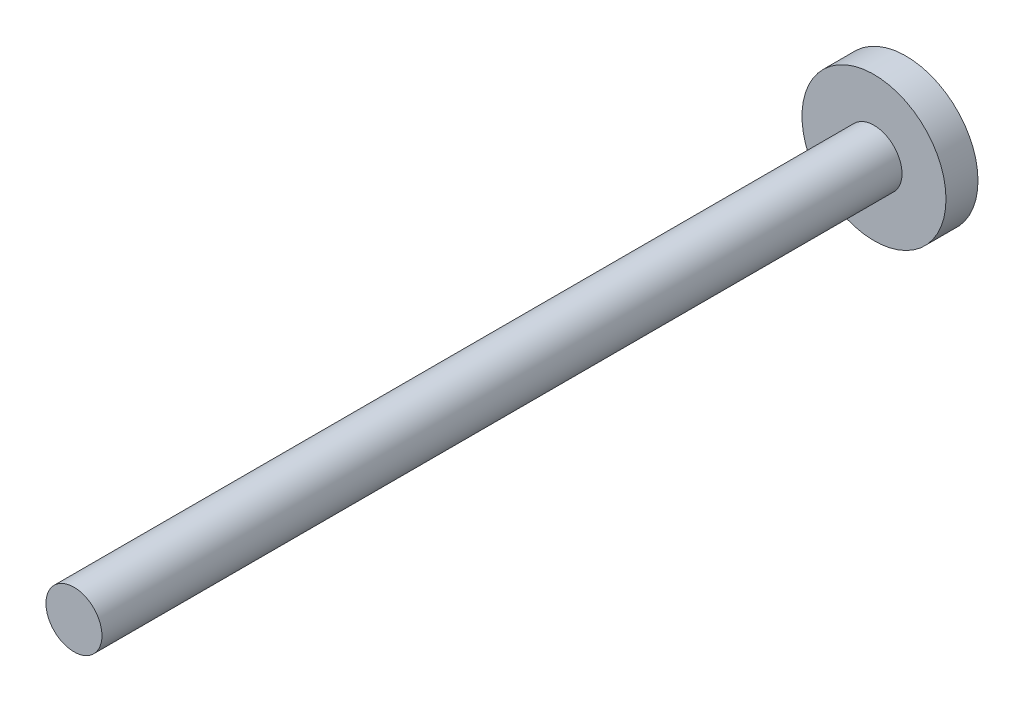
ISO-10303-21;
HEADER;
FILE_DESCRIPTION(('STEP AP214'),'2;1');
FILE_NAME('part.step','',(''),(''),'','','');
FILE_SCHEMA(('AUTOMOTIVE_DESIGN { 1 0 10303 214 1 1 1 1 }'));
ENDSEC;
DATA;
#1=APPLICATION_CONTEXT('core data for automotive mechanical design processes');
#2=APPLICATION_PROTOCOL_DEFINITION('international standard','automotive_design',2000,#1);
#3=PRODUCT_CONTEXT('',#1,'mechanical');
#4=PRODUCT('Part','Part','',(#3));
#5=PRODUCT_RELATED_PRODUCT_CATEGORY('part','',(#4));
#6=PRODUCT_DEFINITION_FORMATION('','',#4);
#7=PRODUCT_DEFINITION_CONTEXT('part definition',#1,'design');
#8=PRODUCT_DEFINITION('design','',#6,#7);
#9=PRODUCT_DEFINITION_SHAPE('','',#8);
#10=(LENGTH_UNIT() NAMED_UNIT(*) SI_UNIT(.MILLI.,.METRE.));
#11=(NAMED_UNIT(*) PLANE_ANGLE_UNIT() SI_UNIT($,.RADIAN.));
#12=(NAMED_UNIT(*) SI_UNIT($,.STERADIAN.) SOLID_ANGLE_UNIT());
#13=UNCERTAINTY_MEASURE_WITH_UNIT(LENGTH_MEASURE(1.E-05),#10,'distance_accuracy_value','');
#14=(GEOMETRIC_REPRESENTATION_CONTEXT(3) GLOBAL_UNCERTAINTY_ASSIGNED_CONTEXT((#13)) GLOBAL_UNIT_ASSIGNED_CONTEXT((#10,
#11,#12)) REPRESENTATION_CONTEXT('',''));
#15=CARTESIAN_POINT('',(0.,0.,0.));
#16=DIRECTION('',(0.,0.,1.));
#17=DIRECTION('',(1.,0.,0.));
#18=AXIS2_PLACEMENT_3D('',#15,#16,#17);
#19=CARTESIAN_POINT('',(0.,0.,2.));
#20=DIRECTION('',(0.,0.,-1.));
#21=DIRECTION('',(-1.,0.,0.));
#22=AXIS2_PLACEMENT_3D('',#19,#20,#21);
#23=CYLINDRICAL_SURFACE('',#22,4.5);
#24=CARTESIAN_POINT('',(0.,0.,2.));
#25=DIRECTION('',(0.,0.,1.));
#26=DIRECTION('',(1.,0.,0.));
#27=AXIS2_PLACEMENT_3D('',#24,#25,#26);
#28=CIRCLE('',#27,4.5);
#29=CARTESIAN_POINT('',(4.5,0.,2.));
#30=VERTEX_POINT('',#29);
#31=EDGE_CURVE('E45',#30,#30,#28,.T.);
#32=ORIENTED_EDGE('',*,*,#31,.F.);
#33=EDGE_LOOP('',(#32));
#34=FACE_BOUND('',#33,.T.);
#35=CARTESIAN_POINT('',(0.,0.,0.));
#36=DIRECTION('',(0.,0.,1.));
#37=DIRECTION('',(1.,0.,0.));
#38=AXIS2_PLACEMENT_3D('',#35,#36,#37);
#39=CIRCLE('',#38,4.5);
#40=CARTESIAN_POINT('',(4.5,0.,0.));
#41=VERTEX_POINT('',#40);
#42=EDGE_CURVE('E40',#41,#41,#39,.T.);
#43=ORIENTED_EDGE('',*,*,#42,.T.);
#44=EDGE_LOOP('',(#43));
#45=FACE_BOUND('',#44,.T.);
#46=ADVANCED_FACE('F37',(#34,#45),#23,.T.);
#47=CARTESIAN_POINT('',(0.,0.,2.));
#48=DIRECTION('',(0.,0.,1.));
#49=DIRECTION('',(1.,0.,0.));
#50=AXIS2_PLACEMENT_3D('',#47,#48,#49);
#51=PLANE('',#50);
#52=CARTESIAN_POINT('',(0.,0.,2.));
#53=DIRECTION('',(0.,0.,1.));
#54=DIRECTION('',(1.,0.,0.));
#55=AXIS2_PLACEMENT_3D('',#52,#53,#54);
#56=CIRCLE('',#55,1.75);
#57=CARTESIAN_POINT('',(1.75,0.,2.));
#58=VERTEX_POINT('',#57);
#59=EDGE_CURVE('E10',#58,#58,#56,.T.);
#60=ORIENTED_EDGE('',*,*,#59,.F.);
#61=EDGE_LOOP('',(#60));
#62=FACE_BOUND('',#61,.T.);
#63=ORIENTED_EDGE('',*,*,#31,.T.);
#64=EDGE_LOOP('',(#63));
#65=FACE_BOUND('',#64,.T.);
#66=ADVANCED_FACE('F65',(#62,#65),#51,.T.);
#67=CARTESIAN_POINT('',(0.,0.,0.));
#68=DIRECTION('',(0.,0.,1.));
#69=DIRECTION('',(1.,0.,0.));
#70=AXIS2_PLACEMENT_3D('',#67,#68,#69);
#71=PLANE('',#70);
#72=ORIENTED_EDGE('',*,*,#42,.F.);
#73=EDGE_LOOP('',(#72));
#74=FACE_BOUND('',#73,.T.);
#75=ADVANCED_FACE('F62',(#74),#71,.F.);
#76=CARTESIAN_POINT('',(0.,0.,52.));
#77=DIRECTION('',(0.,0.,-1.));
#78=DIRECTION('',(-1.,0.,0.));
#79=AXIS2_PLACEMENT_3D('',#76,#77,#78);
#80=CYLINDRICAL_SURFACE('',#79,1.75);
#81=CARTESIAN_POINT('',(0.,0.,52.));
#82=DIRECTION('',(0.,0.,1.));
#83=DIRECTION('',(1.,0.,0.));
#84=AXIS2_PLACEMENT_3D('',#81,#82,#83);
#85=CIRCLE('',#84,1.75);
#86=CARTESIAN_POINT('',(1.75,0.,52.));
#87=VERTEX_POINT('',#86);
#88=EDGE_CURVE('E52',#87,#87,#85,.T.);
#89=ORIENTED_EDGE('',*,*,#88,.F.);
#90=EDGE_LOOP('',(#89));
#91=FACE_BOUND('',#90,.T.);
#92=ORIENTED_EDGE('',*,*,#59,.T.);
#93=EDGE_LOOP('',(#92));
#94=FACE_BOUND('',#93,.T.);
#95=ADVANCED_FACE('F64',(#91,#94),#80,.T.);
#96=CARTESIAN_POINT('',(0.,0.,52.));
#97=DIRECTION('',(0.,0.,1.));
#98=DIRECTION('',(1.,0.,0.));
#99=AXIS2_PLACEMENT_3D('',#96,#97,#98);
#100=PLANE('',#99);
#101=ORIENTED_EDGE('',*,*,#88,.T.);
#102=EDGE_LOOP('',(#101));
#103=FACE_BOUND('',#102,.T.);
#104=ADVANCED_FACE('F70',(#103),#100,.T.);
#105=CLOSED_SHELL('',(#46,#66,#75,#95,#104));
#106=MANIFOLD_SOLID_BREP('B2',#105);
#107=ADVANCED_BREP_SHAPE_REPRESENTATION('',(#18,#106),#14);
#108=SHAPE_DEFINITION_REPRESENTATION(#9,#107);
ENDSEC;
END-ISO-10303-21;
